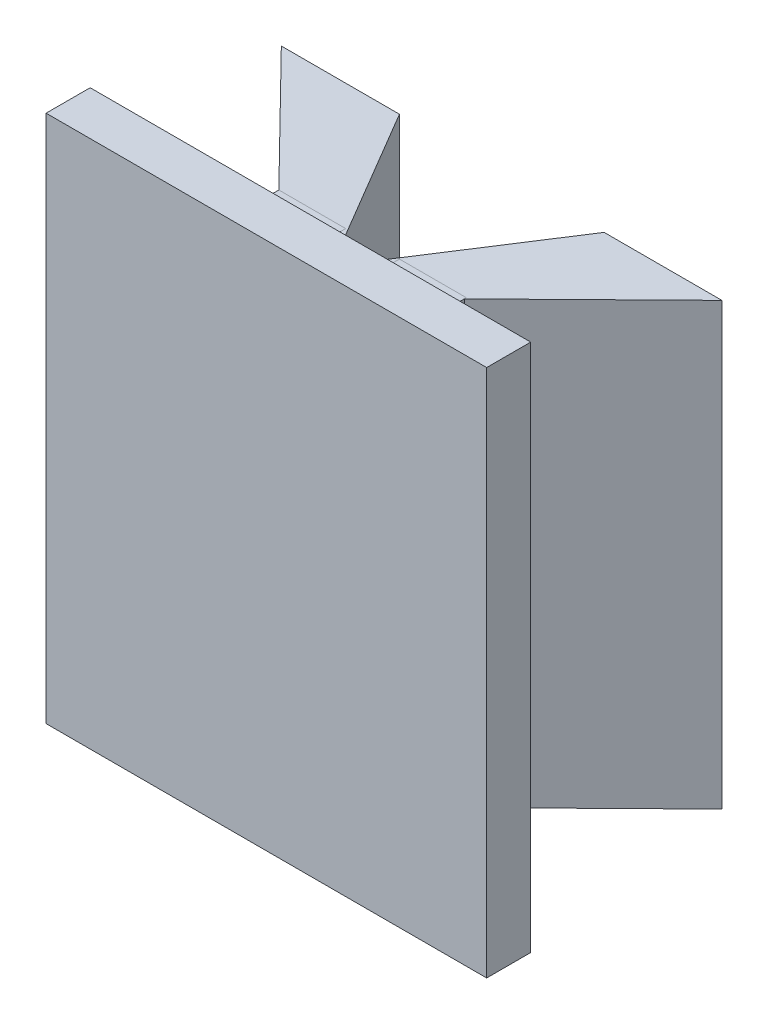
ISO-10303-21;
HEADER;
FILE_DESCRIPTION(('STEP AP214'),'2;1');
FILE_NAME('part.step','',(''),(''),'','','');
FILE_SCHEMA(('AUTOMOTIVE_DESIGN { 1 0 10303 214 1 1 1 1 }'));
ENDSEC;
DATA;
#1=APPLICATION_CONTEXT('core data for automotive mechanical design processes');
#2=APPLICATION_PROTOCOL_DEFINITION('international standard','automotive_design',2000,#1);
#3=PRODUCT_CONTEXT('',#1,'mechanical');
#4=PRODUCT('Part','Part','',(#3));
#5=PRODUCT_RELATED_PRODUCT_CATEGORY('part','',(#4));
#6=PRODUCT_DEFINITION_FORMATION('','',#4);
#7=PRODUCT_DEFINITION_CONTEXT('part definition',#1,'design');
#8=PRODUCT_DEFINITION('design','',#6,#7);
#9=PRODUCT_DEFINITION_SHAPE('','',#8);
#10=(LENGTH_UNIT() NAMED_UNIT(*) SI_UNIT(.MILLI.,.METRE.));
#11=(NAMED_UNIT(*) PLANE_ANGLE_UNIT() SI_UNIT($,.RADIAN.));
#12=(NAMED_UNIT(*) SI_UNIT($,.STERADIAN.) SOLID_ANGLE_UNIT());
#13=UNCERTAINTY_MEASURE_WITH_UNIT(LENGTH_MEASURE(1.E-05),#10,'distance_accuracy_value','');
#14=(GEOMETRIC_REPRESENTATION_CONTEXT(3) GLOBAL_UNCERTAINTY_ASSIGNED_CONTEXT((#13)) GLOBAL_UNIT_ASSIGNED_CONTEXT((#10,
#11,#12)) REPRESENTATION_CONTEXT('',''));
#15=CARTESIAN_POINT('',(0.,0.,0.));
#16=DIRECTION('',(0.,0.,1.));
#17=DIRECTION('',(1.,0.,0.));
#18=AXIS2_PLACEMENT_3D('',#15,#16,#17);
#19=CARTESIAN_POINT('',(-0.587683550049441,55.,27.9967410538347));
#20=DIRECTION('',(0.7,0.,0.714142842854285));
#21=DIRECTION('',(0.714142842854285,0.,-0.7));
#22=AXIS2_PLACEMENT_3D('',#19,#20,#21);
#23=PLANE('',#22);
#24=DIRECTION('',(-0.714142842854285,0.,0.7));
#25=VECTOR('',#24,1.);
#26=CARTESIAN_POINT('',(-0.587683550049441,55.,27.9967410538347));
#27=LINE('',#26,#25);
#28=CARTESIAN_POINT('',(50.4123164499506,55.,-21.9932579459653));
#29=VERTEX_POINT('',#28);
#30=CARTESIAN_POINT('',(20.8852737744341,55.,6.94903291317439));
#31=VERTEX_POINT('',#30);
#32=EDGE_CURVE('E257',#29,#31,#27,.T.);
#33=ORIENTED_EDGE('',*,*,#32,.T.);
#34=DIRECTION('',(0.,-1.,0.));
#35=VECTOR('',#34,1.);
#36=CARTESIAN_POINT('',(20.8852737744341,55.,6.94903291317438));
#37=LINE('',#36,#35);
#38=CARTESIAN_POINT('',(20.8852737744341,-45.,6.94903291317438));
#39=VERTEX_POINT('',#38);
#40=EDGE_CURVE('E67',#31,#39,#37,.T.);
#41=ORIENTED_EDGE('',*,*,#40,.T.);
#42=DIRECTION('',(-0.714142842854285,0.,0.7));
#43=VECTOR('',#42,1.);
#44=CARTESIAN_POINT('',(-0.587683550049441,-45.,27.9967410538347));
#45=LINE('',#44,#43);
#46=CARTESIAN_POINT('',(50.4123164499506,-45.,-21.9932579459653));
#47=VERTEX_POINT('',#46);
#48=EDGE_CURVE('E191',#47,#39,#45,.T.);
#49=ORIENTED_EDGE('',*,*,#48,.F.);
#50=DIRECTION('',(0.,-1.,0.));
#51=VECTOR('',#50,1.);
#52=CARTESIAN_POINT('',(50.4123164499506,55.,-21.9932579459653));
#53=LINE('',#52,#51);
#54=EDGE_CURVE('E279',#29,#47,#53,.T.);
#55=ORIENTED_EDGE('',*,*,#54,.F.);
#56=EDGE_LOOP('',(#33,#41,#49,#55));
#57=FACE_BOUND('',#56,.T.);
#58=ADVANCED_FACE('F43',(#57),#23,.T.);
#59=CARTESIAN_POINT('',(-0.587683550049441,55.,27.9967410538347));
#60=DIRECTION('',(0.,1.,0.));
#61=DIRECTION('',(0.,0.,1.));
#62=AXIS2_PLACEMENT_3D('',#59,#60,#61);
#63=PLANE('',#62);
#64=DIRECTION('',(1.,0.,0.));
#65=VECTOR('',#64,1.);
#66=CARTESIAN_POINT('',(-0.587683550049441,55.,6.48727809469907));
#67=LINE('',#66,#65);
#68=CARTESIAN_POINT('',(5.70443947820123,55.,6.48727809469907));
#69=VERTEX_POINT('',#68);
#70=CARTESIAN_POINT('',(20.8852737744341,55.,6.48727809469907));
#71=VERTEX_POINT('',#70);
#72=EDGE_CURVE('E52',#69,#71,#67,.T.);
#73=ORIENTED_EDGE('',*,*,#72,.T.);
#74=DIRECTION('',(0.,0.,1.));
#75=VECTOR('',#74,1.);
#76=CARTESIAN_POINT('',(20.8852737744341,55.,27.9967410538347));
#77=LINE('',#76,#75);
#78=EDGE_CURVE('E11',#71,#31,#77,.T.);
#79=ORIENTED_EDGE('',*,*,#78,.T.);
#80=ORIENTED_EDGE('',*,*,#32,.F.);
#81=DIRECTION('',(1.,0.,0.));
#82=VECTOR('',#81,1.);
#83=CARTESIAN_POINT('',(-0.587683550049441,55.,-21.9932579459653));
#84=LINE('',#83,#82);
#85=CARTESIAN_POINT('',(23.6769831246106,55.,-21.9932579459653));
#86=VERTEX_POINT('',#85);
#87=EDGE_CURVE('E253',#86,#29,#84,.T.);
#88=ORIENTED_EDGE('',*,*,#87,.F.);
#89=DIRECTION('',(0.542373637045022,0.,-0.840137392239242));
#90=VECTOR('',#89,1.);
#91=CARTESIAN_POINT('',(-6.23979505402684,55.,24.3478661177656));
#92=LINE('',#91,#90);
#93=CARTESIAN_POINT('',(-0.587683550049441,55.,15.5927388489179));
#94=VERTEX_POINT('',#93);
#95=EDGE_CURVE('E239',#94,#86,#92,.T.);
#96=ORIENTED_EDGE('',*,*,#95,.F.);
#97=DIRECTION('',(0.508360217987086,0.,0.861144522579179));
#98=VECTOR('',#97,1.);
#99=CARTESIAN_POINT('',(4.84243655515697,55.,24.7911733842976));
#100=LINE('',#99,#98);
#101=CARTESIAN_POINT('',(-22.7758587319358,55.,-21.9932579459653));
#102=VERTEX_POINT('',#101);
#103=EDGE_CURVE('E243',#102,#94,#100,.T.);
#104=ORIENTED_EDGE('',*,*,#103,.F.);
#105=CARTESIAN_POINT('',(-49.5876835500494,55.,-21.9932579459653));
#106=VERTEX_POINT('',#105);
#107=EDGE_CURVE('E248',#106,#102,#84,.T.);
#108=ORIENTED_EDGE('',*,*,#107,.F.);
#109=DIRECTION('',(-0.7,0.,-0.714142842854285));
#110=VECTOR('',#109,1.);
#111=CARTESIAN_POINT('',(-0.587683550049441,55.,27.9967410538347));
#112=LINE('',#111,#110);
#113=CARTESIAN_POINT('',(-21.5686342400903,55.,6.59188995158993));
#114=VERTEX_POINT('',#113);
#115=EDGE_CURVE('E252',#114,#106,#112,.T.);
#116=ORIENTED_EDGE('',*,*,#115,.F.);
#117=DIRECTION('',(-1.,0.,0.));
#118=VECTOR('',#117,1.);
#119=CARTESIAN_POINT('',(-21.5686342400903,55.,6.59188995158993));
#120=LINE('',#119,#118);
#121=CARTESIAN_POINT('',(-6.38779994385748,55.,6.59188995158993));
#122=VERTEX_POINT('',#121);
#123=EDGE_CURVE('E292',#122,#114,#120,.T.);
#124=ORIENTED_EDGE('',*,*,#123,.F.);
#125=DIRECTION('',(0.,0.,-1.));
#126=VECTOR('',#125,1.);
#127=CARTESIAN_POINT('',(-6.38779994385748,55.,6.59188995158993));
#128=LINE('',#127,#126);
#129=CARTESIAN_POINT('',(-6.38779994385748,55.,18.9046195303274));
#130=VERTEX_POINT('',#129);
#131=EDGE_CURVE('E370',#130,#122,#128,.T.);
#132=ORIENTED_EDGE('',*,*,#131,.F.);
#133=DIRECTION('',(1.,0.,0.));
#134=VECTOR('',#133,1.);
#135=CARTESIAN_POINT('',(18.7262194792623,55.,18.9046195303274));
#136=LINE('',#135,#134);
#137=CARTESIAN_POINT('',(8.68813575334221,55.,18.9046195303274));
#138=VERTEX_POINT('',#137);
#139=EDGE_CURVE('E296',#130,#138,#136,.T.);
#140=ORIENTED_EDGE('',*,*,#139,.T.);
#141=CARTESIAN_POINT('',(8.79486119459407,55.,18.8000076734365));
#142=VERTEX_POINT('',#141);
#143=EDGE_CURVE('E256',#142,#138,#27,.T.);
#144=ORIENTED_EDGE('',*,*,#143,.F.);
#145=DIRECTION('',(1.,0.,0.));
#146=VECTOR('',#145,1.);
#147=CARTESIAN_POINT('',(-0.587683550049441,55.,18.8000076734365));
#148=LINE('',#147,#146);
#149=CARTESIAN_POINT('',(5.70443947820124,55.,18.8000076734365));
#150=VERTEX_POINT('',#149);
#151=EDGE_CURVE('E385',#150,#142,#148,.T.);
#152=ORIENTED_EDGE('',*,*,#151,.F.);
#153=DIRECTION('',(0.,0.,1.));
#154=VECTOR('',#153,1.);
#155=CARTESIAN_POINT('',(5.70443947820124,55.,27.9967410538347));
#156=LINE('',#155,#154);
#157=EDGE_CURVE('E388',#69,#150,#156,.T.);
#158=ORIENTED_EDGE('',*,*,#157,.F.);
#159=EDGE_LOOP('',(#73,#79,#80,#88,#96,#104,#108,#116,#124,#132,#140,#144,#152,#158));
#160=FACE_BOUND('',#159,.T.);
#161=ADVANCED_FACE('F395',(#160),#63,.T.);
#162=CARTESIAN_POINT('',(18.7262194792623,-54.,18.9046195303274));
#163=DIRECTION('',(0.,0.,-1.));
#164=DIRECTION('',(-1.,0.,0.));
#165=AXIS2_PLACEMENT_3D('',#162,#163,#164);
#166=PLANE('',#165);
#167=ORIENTED_EDGE('',*,*,#139,.F.);
#168=DIRECTION('',(0.,1.,0.));
#169=VECTOR('',#168,1.);
#170=CARTESIAN_POINT('',(-6.38779994385748,-45.,18.9046195303274));
#171=LINE('',#170,#169);
#172=CARTESIAN_POINT('',(-6.38779994385748,55.0001,18.9046195303274));
#173=VERTEX_POINT('',#172);
#174=EDGE_CURVE('E324',#130,#173,#171,.T.);
#175=ORIENTED_EDGE('',*,*,#174,.T.);
#176=DIRECTION('',(1.,0.,0.));
#177=VECTOR('',#176,1.);
#178=CARTESIAN_POINT('',(-21.5686342400903,55.0001,18.9046195303274));
#179=LINE('',#178,#177);
#180=CARTESIAN_POINT('',(-21.5686342400903,55.0001,18.9046195303274));
#181=VERTEX_POINT('',#180);
#182=EDGE_CURVE('E300',#181,#173,#179,.T.);
#183=ORIENTED_EDGE('',*,*,#182,.F.);
#184=DIRECTION('',(0.,1.,0.));
#185=VECTOR('',#184,1.);
#186=CARTESIAN_POINT('',(-21.5686342400903,-45.,18.9046195303274));
#187=LINE('',#186,#185);
#188=CARTESIAN_POINT('',(-21.5686342400903,-45.,18.9046195303274));
#189=VERTEX_POINT('',#188);
#190=EDGE_CURVE('E325',#189,#181,#187,.T.);
#191=ORIENTED_EDGE('',*,*,#190,.F.);
#192=DIRECTION('',(1.,0.,0.));
#193=VECTOR('',#192,1.);
#194=CARTESIAN_POINT('',(-21.5686342400903,-45.,18.9046195303274));
#195=LINE('',#194,#193);
#196=CARTESIAN_POINT('',(8.68813575334221,-45.,18.9046195303274));
#197=VERTEX_POINT('',#196);
#198=EDGE_CURVE('E316',#189,#197,#195,.T.);
#199=ORIENTED_EDGE('',*,*,#198,.T.);
#200=DIRECTION('',(0.,-1.,0.));
#201=VECTOR('',#200,1.);
#202=CARTESIAN_POINT('',(8.68813575334221,-54.,18.9046195303274));
#203=LINE('',#202,#201);
#204=EDGE_CURVE('E382',#138,#197,#203,.T.);
#205=ORIENTED_EDGE('',*,*,#204,.F.);
#206=EDGE_LOOP('',(#167,#175,#183,#191,#199,#205));
#207=FACE_BOUND('',#206,.T.);
#208=DIRECTION('',(0.,1.,0.));
#209=VECTOR('',#208,1.);
#210=CARTESIAN_POINT('',(-52.0806910532514,-54.,18.9046195303274));
#211=LINE('',#210,#209);
#212=CARTESIAN_POINT('',(-52.0806910532514,-54.,18.9046195303274));
#213=VERTEX_POINT('',#212);
#214=CARTESIAN_POINT('',(-52.0806910532514,66.,18.9046195303274));
#215=VERTEX_POINT('',#214);
#216=EDGE_CURVE('E367',#213,#215,#211,.T.);
#217=ORIENTED_EDGE('',*,*,#216,.T.);
#218=DIRECTION('',(-1.,0.,0.));
#219=VECTOR('',#218,1.);
#220=CARTESIAN_POINT('',(18.7262194792623,66.,18.9046195303274));
#221=LINE('',#220,#219);
#222=CARTESIAN_POINT('',(47.9193089467486,66.,18.9046195303274));
#223=VERTEX_POINT('',#222);
#224=EDGE_CURVE('E349',#223,#215,#221,.T.);
#225=ORIENTED_EDGE('',*,*,#224,.F.);
#226=DIRECTION('',(0.,1.,0.));
#227=VECTOR('',#226,1.);
#228=CARTESIAN_POINT('',(47.9193089467486,-54.,18.9046195303274));
#229=LINE('',#228,#227);
#230=CARTESIAN_POINT('',(47.9193089467486,-54.,18.9046195303274));
#231=VERTEX_POINT('',#230);
#232=EDGE_CURVE('E371',#231,#223,#229,.T.);
#233=ORIENTED_EDGE('',*,*,#232,.F.);
#234=DIRECTION('',(-1.,0.,0.));
#235=VECTOR('',#234,1.);
#236=CARTESIAN_POINT('',(18.7262194792623,-54.,18.9046195303274));
#237=LINE('',#236,#235);
#238=EDGE_CURVE('E362',#231,#213,#237,.T.);
#239=ORIENTED_EDGE('',*,*,#238,.T.);
#240=EDGE_LOOP('',(#217,#225,#233,#239));
#241=FACE_BOUND('',#240,.T.);
#242=ADVANCED_FACE('F426',(#207,#241),#166,.T.);
#243=CARTESIAN_POINT('',(-52.0806910532514,-54.,-215.141575772947));
#244=DIRECTION('',(1.,0.,0.));
#245=DIRECTION('',(0.,0.,-1.));
#246=AXIS2_PLACEMENT_3D('',#243,#244,#245);
#247=PLANE('',#246);
#248=DIRECTION('',(0.,1.,0.));
#249=VECTOR('',#248,1.);
#250=CARTESIAN_POINT('',(-52.0806910532514,-54.,28.9046195303274));
#251=LINE('',#250,#249);
#252=CARTESIAN_POINT('',(-52.0806910532514,-54.,28.9046195303274));
#253=VERTEX_POINT('',#252);
#254=CARTESIAN_POINT('',(-52.0806910532514,66.,28.9046195303274));
#255=VERTEX_POINT('',#254);
#256=EDGE_CURVE('E366',#253,#255,#251,.T.);
#257=ORIENTED_EDGE('',*,*,#256,.T.);
#258=DIRECTION('',(0.,0.,-1.));
#259=VECTOR('',#258,1.);
#260=CARTESIAN_POINT('',(-52.0806910532514,66.,-215.141575772947));
#261=LINE('',#260,#259);
#262=EDGE_CURVE('E328',#255,#215,#261,.T.);
#263=ORIENTED_EDGE('',*,*,#262,.T.);
#264=ORIENTED_EDGE('',*,*,#216,.F.);
#265=DIRECTION('',(0.,0.,-1.));
#266=VECTOR('',#265,1.);
#267=CARTESIAN_POINT('',(-52.0806910532514,-54.,-215.141575772947));
#268=LINE('',#267,#266);
#269=EDGE_CURVE('E353',#253,#213,#268,.T.);
#270=ORIENTED_EDGE('',*,*,#269,.F.);
#271=EDGE_LOOP('',(#257,#263,#264,#270));
#272=FACE_BOUND('',#271,.T.);
#273=ADVANCED_FACE('F45',(#272),#247,.F.);
#274=CARTESIAN_POINT('',(47.9193089467486,-54.,-215.141575772947));
#275=DIRECTION('',(-1.,0.,0.));
#276=DIRECTION('',(0.,0.,1.));
#277=AXIS2_PLACEMENT_3D('',#274,#275,#276);
#278=PLANE('',#277);
#279=ORIENTED_EDGE('',*,*,#232,.T.);
#280=DIRECTION('',(0.,0.,1.));
#281=VECTOR('',#280,1.);
#282=CARTESIAN_POINT('',(47.9193089467486,66.,-215.141575772947));
#283=LINE('',#282,#281);
#284=CARTESIAN_POINT('',(47.9193089467486,66.,28.9046195303274));
#285=VERTEX_POINT('',#284);
#286=EDGE_CURVE('E345',#223,#285,#283,.T.);
#287=ORIENTED_EDGE('',*,*,#286,.T.);
#288=DIRECTION('',(0.,1.,0.));
#289=VECTOR('',#288,1.);
#290=CARTESIAN_POINT('',(47.9193089467486,-54.,28.9046195303274));
#291=LINE('',#290,#289);
#292=CARTESIAN_POINT('',(47.9193089467486,-54.,28.9046195303274));
#293=VERTEX_POINT('',#292);
#294=EDGE_CURVE('E374',#293,#285,#291,.T.);
#295=ORIENTED_EDGE('',*,*,#294,.F.);
#296=DIRECTION('',(0.,0.,1.));
#297=VECTOR('',#296,1.);
#298=CARTESIAN_POINT('',(47.9193089467486,-54.,-215.141575772947));
#299=LINE('',#298,#297);
#300=EDGE_CURVE('E359',#231,#293,#299,.T.);
#301=ORIENTED_EDGE('',*,*,#300,.F.);
#302=EDGE_LOOP('',(#279,#287,#295,#301));
#303=FACE_BOUND('',#302,.T.);
#304=ADVANCED_FACE('F492',(#303),#278,.F.);
#305=CARTESIAN_POINT('',(18.7262194792623,-54.,28.9046195303274));
#306=DIRECTION('',(0.,0.,-1.));
#307=DIRECTION('',(-1.,0.,0.));
#308=AXIS2_PLACEMENT_3D('',#305,#306,#307);
#309=PLANE('',#308);
#310=ORIENTED_EDGE('',*,*,#294,.T.);
#311=DIRECTION('',(-1.,0.,0.));
#312=VECTOR('',#311,1.);
#313=CARTESIAN_POINT('',(18.7262194792623,66.,28.9046195303274));
#314=LINE('',#313,#312);
#315=EDGE_CURVE('E341',#285,#255,#314,.T.);
#316=ORIENTED_EDGE('',*,*,#315,.T.);
#317=ORIENTED_EDGE('',*,*,#256,.F.);
#318=DIRECTION('',(-1.,0.,0.));
#319=VECTOR('',#318,1.);
#320=CARTESIAN_POINT('',(18.7262194792623,-54.,28.9046195303274));
#321=LINE('',#320,#319);
#322=EDGE_CURVE('E356',#293,#253,#321,.T.);
#323=ORIENTED_EDGE('',*,*,#322,.F.);
#324=EDGE_LOOP('',(#310,#316,#317,#323));
#325=FACE_BOUND('',#324,.T.);
#326=ADVANCED_FACE('F488',(#325),#309,.F.);
#327=CARTESIAN_POINT('',(18.7262194792623,-54.,-215.141575772947));
#328=DIRECTION('',(0.,1.,0.));
#329=DIRECTION('',(0.,0.,1.));
#330=AXIS2_PLACEMENT_3D('',#327,#328,#329);
#331=PLANE('',#330);
#332=ORIENTED_EDGE('',*,*,#269,.T.);
#333=ORIENTED_EDGE('',*,*,#238,.F.);
#334=ORIENTED_EDGE('',*,*,#300,.T.);
#335=ORIENTED_EDGE('',*,*,#322,.T.);
#336=EDGE_LOOP('',(#332,#333,#334,#335));
#337=FACE_BOUND('',#336,.T.);
#338=ADVANCED_FACE('F484',(#337),#331,.F.);
#339=CARTESIAN_POINT('',(18.7262194792623,66.,-215.141575772947));
#340=DIRECTION('',(0.,1.,0.));
#341=DIRECTION('',(0.,0.,1.));
#342=AXIS2_PLACEMENT_3D('',#339,#340,#341);
#343=PLANE('',#342);
#344=ORIENTED_EDGE('',*,*,#262,.F.);
#345=ORIENTED_EDGE('',*,*,#315,.F.);
#346=ORIENTED_EDGE('',*,*,#286,.F.);
#347=ORIENTED_EDGE('',*,*,#224,.T.);
#348=EDGE_LOOP('',(#344,#345,#346,#347));
#349=FACE_BOUND('',#348,.T.);
#350=ADVANCED_FACE('F477',(#349),#343,.T.);
#351=CARTESIAN_POINT('',(-21.5686342400903,-45.,6.59188995158993));
#352=DIRECTION('',(-1.,0.,0.));
#353=DIRECTION('',(0.,0.,1.));
#354=AXIS2_PLACEMENT_3D('',#351,#352,#353);
#355=PLANE('',#354);
#356=ORIENTED_EDGE('',*,*,#190,.T.);
#357=DIRECTION('',(0.,0.,1.));
#358=VECTOR('',#357,1.);
#359=CARTESIAN_POINT('',(-21.5686342400903,55.0001,6.59188995158993));
#360=LINE('',#359,#358);
#361=CARTESIAN_POINT('',(-21.5686342400903,55.0001,6.59188995158993));
#362=VERTEX_POINT('',#361);
#363=EDGE_CURVE('E312',#362,#181,#360,.T.);
#364=ORIENTED_EDGE('',*,*,#363,.F.);
#365=DIRECTION('',(0.,1.,0.));
#366=VECTOR('',#365,1.);
#367=CARTESIAN_POINT('',(-21.5686342400903,-45.,6.59188995158993));
#368=LINE('',#367,#366);
#369=EDGE_CURVE('E332',#114,#362,#368,.T.);
#370=ORIENTED_EDGE('',*,*,#369,.F.);
#371=CARTESIAN_POINT('',(-21.5686342400903,-45.,6.59188995158993));
#372=VERTEX_POINT('',#371);
#373=EDGE_CURVE('E329',#372,#114,#368,.T.);
#374=ORIENTED_EDGE('',*,*,#373,.F.);
#375=DIRECTION('',(0.,0.,1.));
#376=VECTOR('',#375,1.);
#377=CARTESIAN_POINT('',(-21.5686342400903,-45.,6.59188995158993));
#378=LINE('',#377,#376);
#379=EDGE_CURVE('E320',#372,#189,#378,.T.);
#380=ORIENTED_EDGE('',*,*,#379,.T.);
#381=EDGE_LOOP('',(#356,#364,#370,#374,#380));
#382=FACE_BOUND('',#381,.T.);
#383=ADVANCED_FACE('F446',(#382),#355,.T.);
#384=CARTESIAN_POINT('',(-21.5686342400903,-45.,6.59188995158993));
#385=DIRECTION('',(0.,0.,1.));
#386=DIRECTION('',(1.,0.,0.));
#387=AXIS2_PLACEMENT_3D('',#384,#385,#386);
#388=PLANE('',#387);
#389=DIRECTION('',(0.,1.,0.));
#390=VECTOR('',#389,1.);
#391=CARTESIAN_POINT('',(-6.38779994385748,-45.,6.59188995158993));
#392=LINE('',#391,#390);
#393=CARTESIAN_POINT('',(-6.38779994385748,55.0001,6.59188995158993));
#394=VERTEX_POINT('',#393);
#395=EDGE_CURVE('E333',#122,#394,#392,.T.);
#396=ORIENTED_EDGE('',*,*,#395,.F.);
#397=ORIENTED_EDGE('',*,*,#123,.T.);
#398=ORIENTED_EDGE('',*,*,#369,.T.);
#399=DIRECTION('',(1.,0.,0.));
#400=VECTOR('',#399,1.);
#401=CARTESIAN_POINT('',(-21.5686342400903,55.0001,6.59188995158993));
#402=LINE('',#401,#400);
#403=EDGE_CURVE('E308',#362,#394,#402,.T.);
#404=ORIENTED_EDGE('',*,*,#403,.T.);
#405=EDGE_LOOP('',(#396,#397,#398,#404));
#406=FACE_BOUND('',#405,.T.);
#407=ADVANCED_FACE('F457',(#406),#388,.F.);
#408=CARTESIAN_POINT('',(-6.38779994385748,-45.,6.59188995158993));
#409=DIRECTION('',(-1.,0.,0.));
#410=DIRECTION('',(0.,0.,1.));
#411=AXIS2_PLACEMENT_3D('',#408,#409,#410);
#412=PLANE('',#411);
#413=ORIENTED_EDGE('',*,*,#174,.F.);
#414=ORIENTED_EDGE('',*,*,#131,.T.);
#415=ORIENTED_EDGE('',*,*,#395,.T.);
#416=DIRECTION('',(0.,0.,1.));
#417=VECTOR('',#416,1.);
#418=CARTESIAN_POINT('',(-6.38779994385748,55.0001,6.59188995158993));
#419=LINE('',#418,#417);
#420=EDGE_CURVE('E304',#394,#173,#419,.T.);
#421=ORIENTED_EDGE('',*,*,#420,.T.);
#422=EDGE_LOOP('',(#413,#414,#415,#421));
#423=FACE_BOUND('',#422,.T.);
#424=ADVANCED_FACE('F461',(#423),#412,.F.);
#425=CARTESIAN_POINT('',(0.,-45.,0.));
#426=DIRECTION('',(0.,-1.,0.));
#427=DIRECTION('',(0.,0.,-1.));
#428=AXIS2_PLACEMENT_3D('',#425,#426,#427);
#429=PLANE('',#428);
#430=ORIENTED_EDGE('',*,*,#48,.T.);
#431=DIRECTION('',(0.,0.,1.));
#432=VECTOR('',#431,1.);
#433=CARTESIAN_POINT('',(20.8852737744341,-45.,6.48727809469907));
#434=LINE('',#433,#432);
#435=CARTESIAN_POINT('',(20.8852737744341,-45.,18.8000076734365));
#436=VERTEX_POINT('',#435);
#437=EDGE_CURVE('E186',#39,#436,#434,.T.);
#438=ORIENTED_EDGE('',*,*,#437,.T.);
#439=DIRECTION('',(1.,0.,0.));
#440=VECTOR('',#439,1.);
#441=CARTESIAN_POINT('',(5.70443947820124,-45.,18.8000076734365));
#442=LINE('',#441,#440);
#443=CARTESIAN_POINT('',(8.79486119459407,-45.,18.8000076734365));
#444=VERTEX_POINT('',#443);
#445=EDGE_CURVE('E189',#444,#436,#442,.T.);
#446=ORIENTED_EDGE('',*,*,#445,.F.);
#447=EDGE_CURVE('E59',#444,#197,#45,.T.);
#448=ORIENTED_EDGE('',*,*,#447,.T.);
#449=ORIENTED_EDGE('',*,*,#198,.F.);
#450=ORIENTED_EDGE('',*,*,#379,.F.);
#451=DIRECTION('',(-0.7,0.,-0.714142842854285));
#452=VECTOR('',#451,1.);
#453=CARTESIAN_POINT('',(-0.587683550049441,-45.,27.9967410538347));
#454=LINE('',#453,#452);
#455=CARTESIAN_POINT('',(-49.5876835500494,-45.,-21.9932579459653));
#456=VERTEX_POINT('',#455);
#457=EDGE_CURVE('E271',#372,#456,#454,.T.);
#458=ORIENTED_EDGE('',*,*,#457,.T.);
#459=DIRECTION('',(1.,0.,0.));
#460=VECTOR('',#459,1.);
#461=CARTESIAN_POINT('',(-0.587683550049441,-45.,-21.9932579459653));
#462=LINE('',#461,#460);
#463=CARTESIAN_POINT('',(-22.7758587319358,-45.,-21.9932579459653));
#464=VERTEX_POINT('',#463);
#465=EDGE_CURVE('E267',#456,#464,#462,.T.);
#466=ORIENTED_EDGE('',*,*,#465,.T.);
#467=DIRECTION('',(0.508360217987086,0.,0.861144522579179));
#468=VECTOR('',#467,1.);
#469=CARTESIAN_POINT('',(4.84243655515697,-45.,24.7911733842976));
#470=LINE('',#469,#468);
#471=CARTESIAN_POINT('',(-0.587683550049441,-45.,15.5927388489179));
#472=VERTEX_POINT('',#471);
#473=EDGE_CURVE('E263',#464,#472,#470,.T.);
#474=ORIENTED_EDGE('',*,*,#473,.T.);
#475=DIRECTION('',(0.542373637045022,0.,-0.840137392239242));
#476=VECTOR('',#475,1.);
#477=CARTESIAN_POINT('',(-6.23979505402684,-45.,24.3478661177656));
#478=LINE('',#477,#476);
#479=CARTESIAN_POINT('',(23.6769831246106,-45.,-21.9932579459653));
#480=VERTEX_POINT('',#479);
#481=EDGE_CURVE('E238',#472,#480,#478,.T.);
#482=ORIENTED_EDGE('',*,*,#481,.T.);
#483=EDGE_CURVE('E244',#480,#47,#462,.T.);
#484=ORIENTED_EDGE('',*,*,#483,.T.);
#485=EDGE_LOOP('',(#430,#438,#446,#448,#449,#450,#458,#466,#474,#482,#484));
#486=FACE_BOUND('',#485,.T.);
#487=ADVANCED_FACE('F188',(#486),#429,.T.);
#488=CARTESIAN_POINT('',(0.,55.0001,0.));
#489=DIRECTION('',(0.,-1.,0.));
#490=DIRECTION('',(0.,0.,-1.));
#491=AXIS2_PLACEMENT_3D('',#488,#489,#490);
#492=PLANE('',#491);
#493=ORIENTED_EDGE('',*,*,#182,.T.);
#494=ORIENTED_EDGE('',*,*,#420,.F.);
#495=ORIENTED_EDGE('',*,*,#403,.F.);
#496=ORIENTED_EDGE('',*,*,#363,.T.);
#497=EDGE_LOOP('',(#493,#494,#495,#496));
#498=FACE_BOUND('',#497,.T.);
#499=ADVANCED_FACE('F463',(#498),#492,.F.);
#500=CARTESIAN_POINT('',(-0.587683550049441,55.,27.9967410538347));
#501=DIRECTION('',(-0.714142842854285,0.,0.7));
#502=DIRECTION('',(0.7,0.,0.714142842854285));
#503=AXIS2_PLACEMENT_3D('',#500,#501,#502);
#504=PLANE('',#503);
#505=ORIENTED_EDGE('',*,*,#373,.T.);
#506=ORIENTED_EDGE('',*,*,#115,.T.);
#507=DIRECTION('',(0.,-1.,0.));
#508=VECTOR('',#507,1.);
#509=CARTESIAN_POINT('',(-49.5876835500494,55.,-21.9932579459653));
#510=LINE('',#509,#508);
#511=EDGE_CURVE('E282',#106,#456,#510,.T.);
#512=ORIENTED_EDGE('',*,*,#511,.T.);
#513=ORIENTED_EDGE('',*,*,#457,.F.);
#514=EDGE_LOOP('',(#505,#506,#512,#513));
#515=FACE_BOUND('',#514,.T.);
#516=ADVANCED_FACE('F451',(#515),#504,.T.);
#517=CARTESIAN_POINT('',(-6.23979505402684,55.,24.3478661177656));
#518=DIRECTION('',(-0.840137392239242,0.,-0.542373637045022));
#519=DIRECTION('',(-0.542373637045022,0.,0.840137392239242));
#520=AXIS2_PLACEMENT_3D('',#517,#518,#519);
#521=PLANE('',#520);
#522=ORIENTED_EDGE('',*,*,#481,.F.);
#523=DIRECTION('',(0.,-1.,0.));
#524=VECTOR('',#523,1.);
#525=CARTESIAN_POINT('',(-0.587683550049441,55.,15.5927388489179));
#526=LINE('',#525,#524);
#527=EDGE_CURVE('E289',#94,#472,#526,.T.);
#528=ORIENTED_EDGE('',*,*,#527,.F.);
#529=ORIENTED_EDGE('',*,*,#95,.T.);
#530=DIRECTION('',(0.,-1.,0.));
#531=VECTOR('',#530,1.);
#532=CARTESIAN_POINT('',(23.6769831246106,55.,-21.9932579459653));
#533=LINE('',#532,#531);
#534=EDGE_CURVE('E276',#86,#480,#533,.T.);
#535=ORIENTED_EDGE('',*,*,#534,.T.);
#536=EDGE_LOOP('',(#522,#528,#529,#535));
#537=FACE_BOUND('',#536,.T.);
#538=ADVANCED_FACE('F470',(#537),#521,.T.);
#539=CARTESIAN_POINT('',(4.84243655515697,55.,24.7911733842976));
#540=DIRECTION('',(0.861144522579179,0.,-0.508360217987086));
#541=DIRECTION('',(-0.508360217987086,0.,-0.861144522579179));
#542=AXIS2_PLACEMENT_3D('',#539,#540,#541);
#543=PLANE('',#542);
#544=ORIENTED_EDGE('',*,*,#473,.F.);
#545=DIRECTION('',(0.,-1.,0.));
#546=VECTOR('',#545,1.);
#547=CARTESIAN_POINT('',(-22.7758587319358,55.,-21.9932579459653));
#548=LINE('',#547,#546);
#549=EDGE_CURVE('E286',#102,#464,#548,.T.);
#550=ORIENTED_EDGE('',*,*,#549,.F.);
#551=ORIENTED_EDGE('',*,*,#103,.T.);
#552=ORIENTED_EDGE('',*,*,#527,.T.);
#553=EDGE_LOOP('',(#544,#550,#551,#552));
#554=FACE_BOUND('',#553,.T.);
#555=ADVANCED_FACE('F433',(#554),#543,.T.);
#556=CARTESIAN_POINT('',(-0.587683550049441,55.,-21.9932579459653));
#557=DIRECTION('',(0.,0.,-1.));
#558=DIRECTION('',(-1.,0.,0.));
#559=AXIS2_PLACEMENT_3D('',#556,#557,#558);
#560=PLANE('',#559);
#561=ORIENTED_EDGE('',*,*,#465,.F.);
#562=ORIENTED_EDGE('',*,*,#511,.F.);
#563=ORIENTED_EDGE('',*,*,#107,.T.);
#564=ORIENTED_EDGE('',*,*,#549,.T.);
#565=EDGE_LOOP('',(#561,#562,#563,#564));
#566=FACE_BOUND('',#565,.T.);
#567=ADVANCED_FACE('F419',(#566),#560,.T.);
#568=DIRECTION('',(0.,-1.,0.));
#569=VECTOR('',#568,1.);
#570=CARTESIAN_POINT('',(8.79486119459407,55.,18.8000076734365));
#571=LINE('',#570,#569);
#572=EDGE_CURVE('E203',#142,#444,#571,.T.);
#573=ORIENTED_EDGE('',*,*,#572,.F.);
#574=ORIENTED_EDGE('',*,*,#143,.T.);
#575=ORIENTED_EDGE('',*,*,#204,.T.);
#576=ORIENTED_EDGE('',*,*,#447,.F.);
#577=EDGE_LOOP('',(#573,#574,#575,#576));
#578=FACE_BOUND('',#577,.T.);
#579=ADVANCED_FACE('F416',(#578),#23,.T.);
#580=ORIENTED_EDGE('',*,*,#483,.F.);
#581=ORIENTED_EDGE('',*,*,#534,.F.);
#582=ORIENTED_EDGE('',*,*,#87,.T.);
#583=ORIENTED_EDGE('',*,*,#54,.T.);
#584=EDGE_LOOP('',(#580,#581,#582,#583));
#585=FACE_BOUND('',#584,.T.);
#586=ADVANCED_FACE('F409',(#585),#560,.T.);
#587=CARTESIAN_POINT('',(5.70443947820123,-45.,6.48727809469907));
#588=DIRECTION('',(-1.,0.,0.));
#589=DIRECTION('',(0.,0.,1.));
#590=AXIS2_PLACEMENT_3D('',#587,#588,#589);
#591=PLANE('',#590);
#592=DIRECTION('',(0.,1.,0.));
#593=VECTOR('',#592,1.);
#594=CARTESIAN_POINT('',(5.70443947820123,-45.,6.48727809469907));
#595=LINE('',#594,#593);
#596=CARTESIAN_POINT('',(5.70443947820123,55.0001,6.48727809469907));
#597=VERTEX_POINT('',#596);
#598=EDGE_CURVE('E217',#69,#597,#595,.T.);
#599=ORIENTED_EDGE('',*,*,#598,.F.);
#600=ORIENTED_EDGE('',*,*,#157,.T.);
#601=DIRECTION('',(0.,1.,0.));
#602=VECTOR('',#601,1.);
#603=CARTESIAN_POINT('',(5.70443947820124,-45.,18.8000076734365));
#604=LINE('',#603,#602);
#605=CARTESIAN_POINT('',(5.70443947820124,55.0001,18.8000076734365));
#606=VERTEX_POINT('',#605);
#607=EDGE_CURVE('E195',#150,#606,#604,.T.);
#608=ORIENTED_EDGE('',*,*,#607,.T.);
#609=DIRECTION('',(0.,0.,1.));
#610=VECTOR('',#609,1.);
#611=CARTESIAN_POINT('',(5.70443947820123,55.0001,6.48727809469907));
#612=LINE('',#611,#610);
#613=EDGE_CURVE('E230',#597,#606,#612,.T.);
#614=ORIENTED_EDGE('',*,*,#613,.F.);
#615=EDGE_LOOP('',(#599,#600,#608,#614));
#616=FACE_BOUND('',#615,.T.);
#617=ADVANCED_FACE('F407',(#616),#591,.T.);
#618=CARTESIAN_POINT('',(5.70443947820123,-45.,6.48727809469907));
#619=DIRECTION('',(0.,0.,1.));
#620=DIRECTION('',(1.,0.,0.));
#621=AXIS2_PLACEMENT_3D('',#618,#619,#620);
#622=PLANE('',#621);
#623=ORIENTED_EDGE('',*,*,#72,.F.);
#624=ORIENTED_EDGE('',*,*,#598,.T.);
#625=DIRECTION('',(1.,0.,0.));
#626=VECTOR('',#625,1.);
#627=CARTESIAN_POINT('',(5.70443947820123,55.0001,6.48727809469907));
#628=LINE('',#627,#626);
#629=CARTESIAN_POINT('',(20.8852737744341,55.0001,6.48727809469907));
#630=VERTEX_POINT('',#629);
#631=EDGE_CURVE('E205',#597,#630,#628,.T.);
#632=ORIENTED_EDGE('',*,*,#631,.T.);
#633=DIRECTION('',(0.,1.,0.));
#634=VECTOR('',#633,1.);
#635=CARTESIAN_POINT('',(20.8852737744341,-45.,6.48727809469907));
#636=LINE('',#635,#634);
#637=EDGE_CURVE('E212',#71,#630,#636,.T.);
#638=ORIENTED_EDGE('',*,*,#637,.F.);
#639=EDGE_LOOP('',(#623,#624,#632,#638));
#640=FACE_BOUND('',#639,.T.);
#641=ADVANCED_FACE('F400',(#640),#622,.F.);
#642=CARTESIAN_POINT('',(20.8852737744341,-45.,6.48727809469907));
#643=DIRECTION('',(-1.,0.,0.));
#644=DIRECTION('',(0.,0.,1.));
#645=AXIS2_PLACEMENT_3D('',#642,#643,#644);
#646=PLANE('',#645);
#647=ORIENTED_EDGE('',*,*,#40,.F.);
#648=ORIENTED_EDGE('',*,*,#78,.F.);
#649=ORIENTED_EDGE('',*,*,#637,.T.);
#650=DIRECTION('',(0.,0.,1.));
#651=VECTOR('',#650,1.);
#652=CARTESIAN_POINT('',(20.8852737744341,55.0001,6.48727809469907));
#653=LINE('',#652,#651);
#654=CARTESIAN_POINT('',(20.8852737744341,55.0001,18.8000076734365));
#655=VERTEX_POINT('',#654);
#656=EDGE_CURVE('E210',#630,#655,#653,.T.);
#657=ORIENTED_EDGE('',*,*,#656,.T.);
#658=DIRECTION('',(0.,1.,0.));
#659=VECTOR('',#658,1.);
#660=CARTESIAN_POINT('',(20.8852737744341,-45.,18.8000076734365));
#661=LINE('',#660,#659);
#662=EDGE_CURVE('E201',#436,#655,#661,.T.);
#663=ORIENTED_EDGE('',*,*,#662,.F.);
#664=ORIENTED_EDGE('',*,*,#437,.F.);
#665=EDGE_LOOP('',(#647,#648,#649,#657,#663,#664));
#666=FACE_BOUND('',#665,.T.);
#667=ADVANCED_FACE('F208',(#666),#646,.F.);
#668=CARTESIAN_POINT('',(5.70443947820124,-45.,18.8000076734365));
#669=DIRECTION('',(0.,0.,1.));
#670=DIRECTION('',(1.,0.,0.));
#671=AXIS2_PLACEMENT_3D('',#668,#669,#670);
#672=PLANE('',#671);
#673=ORIENTED_EDGE('',*,*,#151,.T.);
#674=ORIENTED_EDGE('',*,*,#572,.T.);
#675=ORIENTED_EDGE('',*,*,#445,.T.);
#676=ORIENTED_EDGE('',*,*,#662,.T.);
#677=DIRECTION('',(1.,0.,0.));
#678=VECTOR('',#677,1.);
#679=CARTESIAN_POINT('',(5.70443947820124,55.0001,18.8000076734365));
#680=LINE('',#679,#678);
#681=EDGE_CURVE('E227',#606,#655,#680,.T.);
#682=ORIENTED_EDGE('',*,*,#681,.F.);
#683=ORIENTED_EDGE('',*,*,#607,.F.);
#684=EDGE_LOOP('',(#673,#674,#675,#676,#682,#683));
#685=FACE_BOUND('',#684,.T.);
#686=ADVANCED_FACE('F199',(#685),#672,.T.);
#687=CARTESIAN_POINT('',(0.,55.0001,0.));
#688=DIRECTION('',(0.,1.,0.));
#689=DIRECTION('',(0.,0.,1.));
#690=AXIS2_PLACEMENT_3D('',#687,#688,#689);
#691=PLANE('',#690);
#692=ORIENTED_EDGE('',*,*,#613,.T.);
#693=ORIENTED_EDGE('',*,*,#681,.T.);
#694=ORIENTED_EDGE('',*,*,#656,.F.);
#695=ORIENTED_EDGE('',*,*,#631,.F.);
#696=EDGE_LOOP('',(#692,#693,#694,#695));
#697=FACE_BOUND('',#696,.T.);
#698=ADVANCED_FACE('F404',(#697),#691,.T.);
#699=CLOSED_SHELL('',(#58,#161,#242,#273,#304,#326,#338,#350,#383,#407,#424,#487,#499,#516,#538,
#555,#567,#579,#586,#617,#641,#667,#686,#698));
#700=MANIFOLD_SOLID_BREP('B2',#699);
#701=ADVANCED_BREP_SHAPE_REPRESENTATION('',(#18,#700),#14);
#702=SHAPE_DEFINITION_REPRESENTATION(#9,#701);
ENDSEC;
END-ISO-10303-21;
